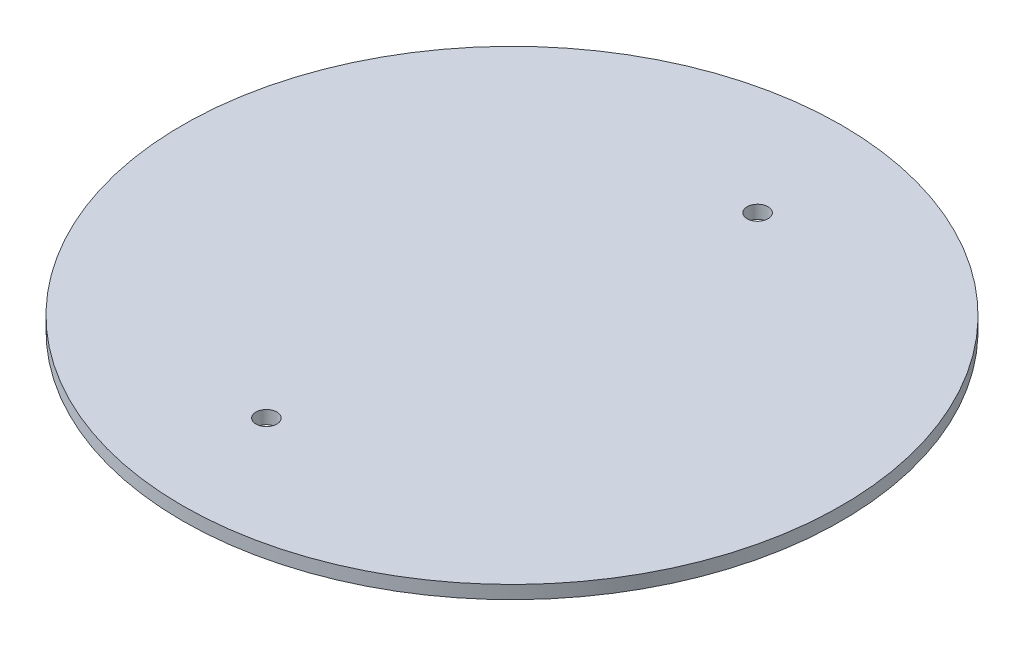
ISO-10303-21;
HEADER;
FILE_DESCRIPTION(('STEP AP214'),'2;1');
FILE_NAME('part.step','',(''),(''),'','','');
FILE_SCHEMA(('AUTOMOTIVE_DESIGN { 1 0 10303 214 1 1 1 1 }'));
ENDSEC;
DATA;
#1=APPLICATION_CONTEXT('core data for automotive mechanical design processes');
#2=APPLICATION_PROTOCOL_DEFINITION('international standard','automotive_design',2000,#1);
#3=PRODUCT_CONTEXT('',#1,'mechanical');
#4=PRODUCT('Part','Part','',(#3));
#5=PRODUCT_RELATED_PRODUCT_CATEGORY('part','',(#4));
#6=PRODUCT_DEFINITION_FORMATION('','',#4);
#7=PRODUCT_DEFINITION_CONTEXT('part definition',#1,'design');
#8=PRODUCT_DEFINITION('design','',#6,#7);
#9=PRODUCT_DEFINITION_SHAPE('','',#8);
#10=(LENGTH_UNIT() NAMED_UNIT(*) SI_UNIT(.MILLI.,.METRE.));
#11=(NAMED_UNIT(*) PLANE_ANGLE_UNIT() SI_UNIT($,.RADIAN.));
#12=(NAMED_UNIT(*) SI_UNIT($,.STERADIAN.) SOLID_ANGLE_UNIT());
#13=UNCERTAINTY_MEASURE_WITH_UNIT(LENGTH_MEASURE(1.E-05),#10,'distance_accuracy_value','');
#14=(GEOMETRIC_REPRESENTATION_CONTEXT(3) GLOBAL_UNCERTAINTY_ASSIGNED_CONTEXT((#13)) GLOBAL_UNIT_ASSIGNED_CONTEXT((#10,
#11,#12)) REPRESENTATION_CONTEXT('',''));
#15=CARTESIAN_POINT('',(0.,0.,0.));
#16=DIRECTION('',(0.,0.,1.));
#17=DIRECTION('',(1.,0.,0.));
#18=AXIS2_PLACEMENT_3D('',#15,#16,#17);
#19=CARTESIAN_POINT('',(0.,0.8,0.));
#20=DIRECTION('',(0.,1.,0.));
#21=DIRECTION('',(0.,0.,1.));
#22=AXIS2_PLACEMENT_3D('',#19,#20,#21);
#23=PLANE('',#22);
#24=CARTESIAN_POINT('',(-2.05801875,0.8,12.846715625));
#25=DIRECTION('',(0.,1.,0.));
#26=DIRECTION('',(0.,0.,1.));
#27=AXIS2_PLACEMENT_3D('',#24,#25,#26);
#28=CIRCLE('',#27,0.635);
#29=CARTESIAN_POINT('',(-2.05801875,0.8,13.481715625));
#30=VERTEX_POINT('',#29);
#31=EDGE_CURVE('E53',#30,#30,#28,.T.);
#32=ORIENTED_EDGE('',*,*,#31,.F.);
#33=EDGE_LOOP('',(#32));
#34=FACE_BOUND('',#33,.T.);
#35=CARTESIAN_POINT('',(0.,0.8,0.));
#36=DIRECTION('',(0.,1.,0.));
#37=DIRECTION('',(0.,0.,1.));
#38=AXIS2_PLACEMENT_3D('',#35,#36,#37);
#39=CIRCLE('',#38,20.);
#40=CARTESIAN_POINT('',(0.,0.8,20.));
#41=VERTEX_POINT('',#40);
#42=EDGE_CURVE('E11',#41,#41,#39,.T.);
#43=ORIENTED_EDGE('',*,*,#42,.T.);
#44=EDGE_LOOP('',(#43));
#45=FACE_BOUND('',#44,.T.);
#46=CARTESIAN_POINT('',(2.05801875,0.8,-12.846715625));
#47=DIRECTION('',(0.,1.,0.));
#48=DIRECTION('',(0.,0.,1.));
#49=AXIS2_PLACEMENT_3D('',#46,#47,#48);
#50=CIRCLE('',#49,0.635000000000001);
#51=CARTESIAN_POINT('',(2.05801875,0.8,-12.211715625));
#52=VERTEX_POINT('',#51);
#53=EDGE_CURVE('E58',#52,#52,#50,.T.);
#54=ORIENTED_EDGE('',*,*,#53,.F.);
#55=EDGE_LOOP('',(#54));
#56=FACE_BOUND('',#55,.T.);
#57=ADVANCED_FACE('F42',(#34,#45,#56),#23,.T.);
#58=CARTESIAN_POINT('',(0.,0.,0.));
#59=DIRECTION('',(0.,1.,0.));
#60=DIRECTION('',(0.,0.,1.));
#61=AXIS2_PLACEMENT_3D('',#58,#59,#60);
#62=PLANE('',#61);
#63=CARTESIAN_POINT('',(0.,0.,0.));
#64=DIRECTION('',(0.,1.,0.));
#65=DIRECTION('',(0.,0.,1.));
#66=AXIS2_PLACEMENT_3D('',#63,#64,#65);
#67=CIRCLE('',#66,20.);
#68=CARTESIAN_POINT('',(0.,0.,20.));
#69=VERTEX_POINT('',#68);
#70=EDGE_CURVE('E46',#69,#69,#67,.T.);
#71=ORIENTED_EDGE('',*,*,#70,.F.);
#72=EDGE_LOOP('',(#71));
#73=FACE_BOUND('',#72,.T.);
#74=CARTESIAN_POINT('',(-2.05801875,0.,12.846715625));
#75=DIRECTION('',(0.,1.,0.));
#76=DIRECTION('',(0.,0.,1.));
#77=AXIS2_PLACEMENT_3D('',#74,#75,#76);
#78=CIRCLE('',#77,0.635);
#79=CARTESIAN_POINT('',(-2.05801875,0.,13.481715625));
#80=VERTEX_POINT('',#79);
#81=EDGE_CURVE('E55',#80,#80,#78,.T.);
#82=ORIENTED_EDGE('',*,*,#81,.T.);
#83=EDGE_LOOP('',(#82));
#84=FACE_BOUND('',#83,.T.);
#85=CARTESIAN_POINT('',(2.05801875,0.,-12.846715625));
#86=DIRECTION('',(0.,1.,0.));
#87=DIRECTION('',(0.,0.,1.));
#88=AXIS2_PLACEMENT_3D('',#85,#86,#87);
#89=CIRCLE('',#88,0.635000000000001);
#90=CARTESIAN_POINT('',(2.05801875,0.,-12.211715625));
#91=VERTEX_POINT('',#90);
#92=EDGE_CURVE('E61',#91,#91,#89,.T.);
#93=ORIENTED_EDGE('',*,*,#92,.T.);
#94=EDGE_LOOP('',(#93));
#95=FACE_BOUND('',#94,.T.);
#96=ADVANCED_FACE('F71',(#73,#84,#95),#62,.F.);
#97=CARTESIAN_POINT('',(0.,0.8,0.));
#98=DIRECTION('',(0.,-1.,0.));
#99=DIRECTION('',(0.,0.,-1.));
#100=AXIS2_PLACEMENT_3D('',#97,#98,#99);
#101=CYLINDRICAL_SURFACE('',#100,20.);
#102=ORIENTED_EDGE('',*,*,#42,.F.);
#103=EDGE_LOOP('',(#102));
#104=FACE_BOUND('',#103,.T.);
#105=ORIENTED_EDGE('',*,*,#70,.T.);
#106=EDGE_LOOP('',(#105));
#107=FACE_BOUND('',#106,.T.);
#108=ADVANCED_FACE('F44',(#104,#107),#101,.T.);
#109=CARTESIAN_POINT('',(-2.05801875,0.8,12.846715625));
#110=DIRECTION('',(0.,-1.,0.));
#111=DIRECTION('',(0.,0.,-1.));
#112=AXIS2_PLACEMENT_3D('',#109,#110,#111);
#113=CYLINDRICAL_SURFACE('',#112,0.635);
#114=ORIENTED_EDGE('',*,*,#31,.T.);
#115=EDGE_LOOP('',(#114));
#116=FACE_BOUND('',#115,.T.);
#117=ORIENTED_EDGE('',*,*,#81,.F.);
#118=EDGE_LOOP('',(#117));
#119=FACE_BOUND('',#118,.T.);
#120=ADVANCED_FACE('F80',(#116,#119),#113,.F.);
#121=CARTESIAN_POINT('',(2.05801875,0.8,-12.846715625));
#122=DIRECTION('',(0.,-1.,0.));
#123=DIRECTION('',(0.,0.,-1.));
#124=AXIS2_PLACEMENT_3D('',#121,#122,#123);
#125=CYLINDRICAL_SURFACE('',#124,0.635000000000001);
#126=ORIENTED_EDGE('',*,*,#53,.T.);
#127=EDGE_LOOP('',(#126));
#128=FACE_BOUND('',#127,.T.);
#129=ORIENTED_EDGE('',*,*,#92,.F.);
#130=EDGE_LOOP('',(#129));
#131=FACE_BOUND('',#130,.T.);
#132=ADVANCED_FACE('F67',(#128,#131),#125,.F.);
#133=CLOSED_SHELL('',(#57,#96,#108,#120,#132));
#134=MANIFOLD_SOLID_BREP('B2',#133);
#135=ADVANCED_BREP_SHAPE_REPRESENTATION('',(#18,#134),#14);
#136=SHAPE_DEFINITION_REPRESENTATION(#9,#135);
ENDSEC;
END-ISO-10303-21;
